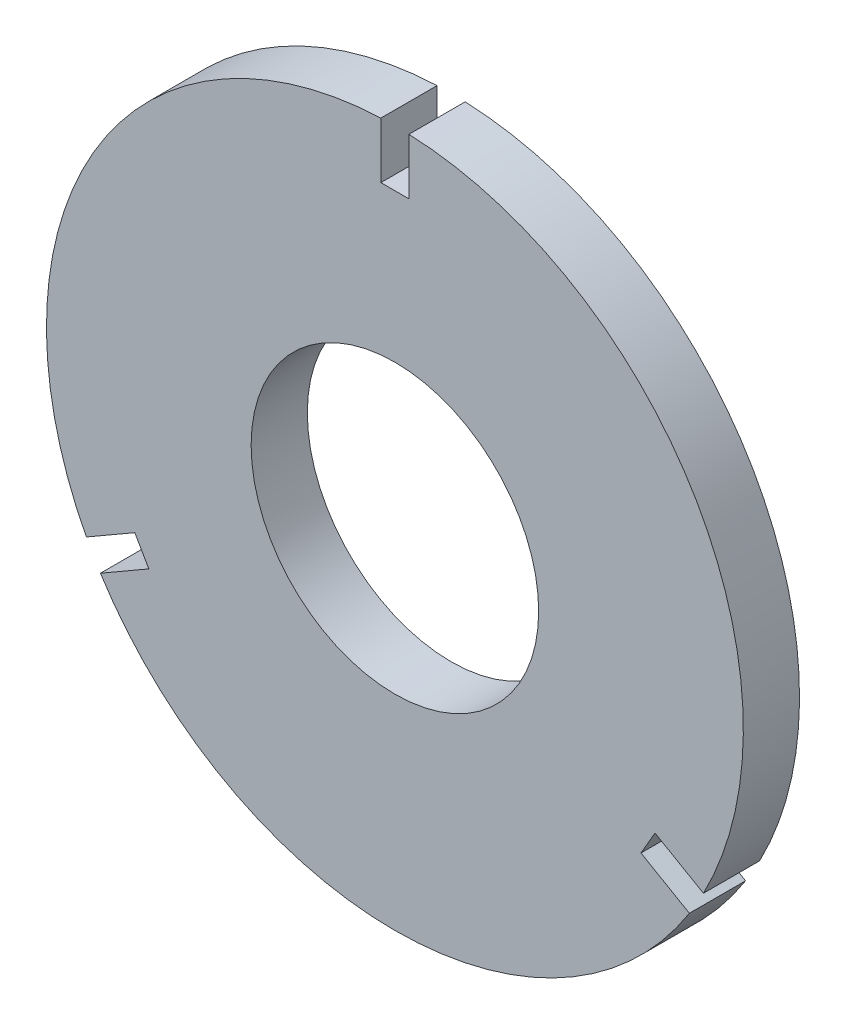
ISO-10303-21;
HEADER;
FILE_DESCRIPTION(('STEP AP214'),'2;1');
FILE_NAME('part.step','',(''),(''),'','','');
FILE_SCHEMA(('AUTOMOTIVE_DESIGN { 1 0 10303 214 1 1 1 1 }'));
ENDSEC;
DATA;
#1=APPLICATION_CONTEXT('core data for automotive mechanical design processes');
#2=APPLICATION_PROTOCOL_DEFINITION('international standard','automotive_design',2000,#1);
#3=PRODUCT_CONTEXT('',#1,'mechanical');
#4=PRODUCT('Part','Part','',(#3));
#5=PRODUCT_RELATED_PRODUCT_CATEGORY('part','',(#4));
#6=PRODUCT_DEFINITION_FORMATION('','',#4);
#7=PRODUCT_DEFINITION_CONTEXT('part definition',#1,'design');
#8=PRODUCT_DEFINITION('design','',#6,#7);
#9=PRODUCT_DEFINITION_SHAPE('','',#8);
#10=(LENGTH_UNIT() NAMED_UNIT(*) SI_UNIT(.MILLI.,.METRE.));
#11=(NAMED_UNIT(*) PLANE_ANGLE_UNIT() SI_UNIT($,.RADIAN.));
#12=(NAMED_UNIT(*) SI_UNIT($,.STERADIAN.) SOLID_ANGLE_UNIT());
#13=UNCERTAINTY_MEASURE_WITH_UNIT(LENGTH_MEASURE(1.E-05),#10,'distance_accuracy_value','');
#14=(GEOMETRIC_REPRESENTATION_CONTEXT(3) GLOBAL_UNCERTAINTY_ASSIGNED_CONTEXT((#13)) GLOBAL_UNIT_ASSIGNED_CONTEXT((#10,
#11,#12)) REPRESENTATION_CONTEXT('',''));
#15=CARTESIAN_POINT('',(0.,0.,0.));
#16=DIRECTION('',(0.,0.,1.));
#17=DIRECTION('',(1.,0.,0.));
#18=AXIS2_PLACEMENT_3D('',#15,#16,#17);
#19=CARTESIAN_POINT('',(0.,0.,6.));
#20=DIRECTION('',(0.,0.,-1.));
#21=DIRECTION('',(-1.,0.,0.));
#22=AXIS2_PLACEMENT_3D('',#19,#20,#21);
#23=CYLINDRICAL_SURFACE('',#22,37.2);
#24=CARTESIAN_POINT('',(0.,0.,6.));
#25=DIRECTION('',(0.,0.,1.));
#26=DIRECTION('',(1.,0.,0.));
#27=AXIS2_PLACEMENT_3D('',#24,#25,#26);
#28=CIRCLE('',#27,37.2);
#29=CARTESIAN_POINT('',(32.9399440819644,-17.2858347752447,6.));
#30=VERTEX_POINT('',#29);
#31=CARTESIAN_POINT('',(1.5,37.1697457618424,6.));
#32=VERTEX_POINT('',#31);
#33=EDGE_CURVE('E210',#30,#32,#28,.T.);
#34=ORIENTED_EDGE('',*,*,#33,.F.);
#35=DIRECTION('',(0.,0.,-1.));
#36=VECTOR('',#35,1.);
#37=CARTESIAN_POINT('',(32.9399440819644,-17.2858347752447,6.));
#38=LINE('',#37,#36);
#39=CARTESIAN_POINT('',(32.9399440819644,-17.2858347752447,0.));
#40=VERTEX_POINT('',#39);
#41=EDGE_CURVE('E11',#30,#40,#38,.T.);
#42=ORIENTED_EDGE('',*,*,#41,.T.);
#43=CARTESIAN_POINT('',(0.,0.,0.));
#44=DIRECTION('',(0.,0.,1.));
#45=DIRECTION('',(1.,0.,0.));
#46=AXIS2_PLACEMENT_3D('',#43,#44,#45);
#47=CIRCLE('',#46,37.2);
#48=CARTESIAN_POINT('',(1.5,37.1697457618424,0.));
#49=VERTEX_POINT('',#48);
#50=EDGE_CURVE('E155',#40,#49,#47,.T.);
#51=ORIENTED_EDGE('',*,*,#50,.T.);
#52=DIRECTION('',(0.,0.,-1.));
#53=VECTOR('',#52,1.);
#54=CARTESIAN_POINT('',(1.5,37.1697457618424,6.));
#55=LINE('',#54,#53);
#56=EDGE_CURVE('E223',#49,#32,#55,.F.);
#57=ORIENTED_EDGE('',*,*,#56,.T.);
#58=EDGE_LOOP('',(#34,#42,#51,#57));
#59=FACE_BOUND('',#58,.T.);
#60=ADVANCED_FACE('F42',(#59),#23,.T.);
#61=CARTESIAN_POINT('',(-1.5,37.1697457618424,6.));
#62=VERTEX_POINT('',#61);
#63=CARTESIAN_POINT('',(-32.9399440819646,-17.2858347752442,6.));
#64=VERTEX_POINT('',#63);
#65=EDGE_CURVE('E215',#62,#64,#28,.T.);
#66=ORIENTED_EDGE('',*,*,#65,.F.);
#67=DIRECTION('',(0.,0.,-1.));
#68=VECTOR('',#67,1.);
#69=CARTESIAN_POINT('',(-1.5,37.1697457618424,6.));
#70=LINE('',#69,#68);
#71=CARTESIAN_POINT('',(-1.5,37.1697457618424,0.));
#72=VERTEX_POINT('',#71);
#73=EDGE_CURVE('E226',#62,#72,#70,.T.);
#74=ORIENTED_EDGE('',*,*,#73,.T.);
#75=CARTESIAN_POINT('',(-32.9399440819646,-17.2858347752442,0.));
#76=VERTEX_POINT('',#75);
#77=EDGE_CURVE('E214',#72,#76,#47,.T.);
#78=ORIENTED_EDGE('',*,*,#77,.T.);
#79=DIRECTION('',(0.,0.,-1.));
#80=VECTOR('',#79,1.);
#81=CARTESIAN_POINT('',(-32.9399440819646,-17.2858347752442,6.));
#82=LINE('',#81,#80);
#83=EDGE_CURVE('E218',#76,#64,#82,.F.);
#84=ORIENTED_EDGE('',*,*,#83,.T.);
#85=EDGE_LOOP('',(#66,#74,#78,#84));
#86=FACE_BOUND('',#85,.T.);
#87=ADVANCED_FACE('F243',(#86),#23,.T.);
#88=CARTESIAN_POINT('',(0.,0.,6.));
#89=DIRECTION('',(0.,0.,1.));
#90=DIRECTION('',(1.,0.,0.));
#91=AXIS2_PLACEMENT_3D('',#88,#89,#90);
#92=PLANE('',#91);
#93=DIRECTION('',(-0.866025403784436,0.500000000000004,0.));
#94=VECTOR('',#93,1.);
#95=CARTESIAN_POINT('',(32.966145020781,-17.3009618943235,6.));
#96=LINE('',#95,#94);
#97=CARTESIAN_POINT('',(27.7699925980744,-14.3009618943235,6.));
#98=VERTEX_POINT('',#97);
#99=EDGE_CURVE('E136',#30,#98,#96,.T.);
#100=ORIENTED_EDGE('',*,*,#99,.F.);
#101=ORIENTED_EDGE('',*,*,#33,.T.);
#102=DIRECTION('',(0.,1.,0.));
#103=VECTOR('',#102,1.);
#104=CARTESIAN_POINT('',(1.5,31.2,6.));
#105=LINE('',#104,#103);
#106=CARTESIAN_POINT('',(1.5,31.2,6.));
#107=VERTEX_POINT('',#106);
#108=EDGE_CURVE('E173',#107,#32,#105,.T.);
#109=ORIENTED_EDGE('',*,*,#108,.F.);
#110=DIRECTION('',(1.,0.,0.));
#111=VECTOR('',#110,1.);
#112=CARTESIAN_POINT('',(-1.5,31.2,6.));
#113=LINE('',#112,#111);
#114=CARTESIAN_POINT('',(-1.5,31.2,6.));
#115=VERTEX_POINT('',#114);
#116=EDGE_CURVE('E175',#115,#107,#113,.T.);
#117=ORIENTED_EDGE('',*,*,#116,.F.);
#118=DIRECTION('',(0.,-1.,0.));
#119=VECTOR('',#118,1.);
#120=CARTESIAN_POINT('',(-1.5,37.2,6.));
#121=LINE('',#120,#119);
#122=EDGE_CURVE('E162',#62,#115,#121,.T.);
#123=ORIENTED_EDGE('',*,*,#122,.F.);
#124=ORIENTED_EDGE('',*,*,#65,.T.);
#125=DIRECTION('',(-0.866025403784443,-0.499999999999992,0.));
#126=VECTOR('',#125,1.);
#127=CARTESIAN_POINT('',(-27.7699925980746,-14.3009618943231,6.));
#128=LINE('',#127,#126);
#129=CARTESIAN_POINT('',(-27.7699925980746,-14.3009618943231,6.));
#130=VERTEX_POINT('',#129);
#131=EDGE_CURVE('E65',#130,#64,#128,.T.);
#132=ORIENTED_EDGE('',*,*,#131,.F.);
#133=DIRECTION('',(-0.499999999999991,0.866025403784444,0.));
#134=VECTOR('',#133,1.);
#135=CARTESIAN_POINT('',(-26.2699925980746,-16.8990381056764,6.));
#136=LINE('',#135,#134);
#137=CARTESIAN_POINT('',(-26.2699925980746,-16.8990381056764,6.));
#138=VERTEX_POINT('',#137);
#139=EDGE_CURVE('E193',#138,#130,#136,.T.);
#140=ORIENTED_EDGE('',*,*,#139,.F.);
#141=DIRECTION('',(0.866025403784444,0.499999999999991,0.));
#142=VECTOR('',#141,1.);
#143=CARTESIAN_POINT('',(-31.4661450207813,-19.8990381056764,6.));
#144=LINE('',#143,#142);
#145=CARTESIAN_POINT('',(-31.4399440819647,-19.8839109865976,6.));
#146=VERTEX_POINT('',#145);
#147=EDGE_CURVE('E172',#146,#138,#144,.T.);
#148=ORIENTED_EDGE('',*,*,#147,.F.);
#149=CARTESIAN_POINT('',(31.4399440819644,-19.883910986598,6.));
#150=VERTEX_POINT('',#149);
#151=EDGE_CURVE('E213',#146,#150,#28,.T.);
#152=ORIENTED_EDGE('',*,*,#151,.T.);
#153=DIRECTION('',(0.866025403784436,-0.500000000000004,0.));
#154=VECTOR('',#153,1.);
#155=CARTESIAN_POINT('',(26.2699925980744,-16.8990381056768,6.));
#156=LINE('',#155,#154);
#157=CARTESIAN_POINT('',(26.2699925980744,-16.8990381056768,6.));
#158=VERTEX_POINT('',#157);
#159=EDGE_CURVE('E57',#158,#150,#156,.T.);
#160=ORIENTED_EDGE('',*,*,#159,.F.);
#161=DIRECTION('',(-0.500000000000005,-0.866025403784436,0.));
#162=VECTOR('',#161,1.);
#163=CARTESIAN_POINT('',(27.7699925980744,-14.3009618943235,6.));
#164=LINE('',#163,#162);
#165=EDGE_CURVE('E157',#98,#158,#164,.T.);
#166=ORIENTED_EDGE('',*,*,#165,.F.);
#167=EDGE_LOOP('',(#100,#101,#109,#117,#123,#124,#132,#140,#148,#152,#160,#166));
#168=FACE_BOUND('',#167,.T.);
#169=CARTESIAN_POINT('',(0.,0.,6.));
#170=DIRECTION('',(0.,0.,1.));
#171=DIRECTION('',(1.,0.,0.));
#172=AXIS2_PLACEMENT_3D('',#169,#170,#171);
#173=CIRCLE('',#172,15.35);
#174=CARTESIAN_POINT('',(15.35,0.,6.));
#175=VERTEX_POINT('',#174);
#176=EDGE_CURVE('E205',#175,#175,#173,.T.);
#177=ORIENTED_EDGE('',*,*,#176,.F.);
#178=EDGE_LOOP('',(#177));
#179=FACE_BOUND('',#178,.T.);
#180=ADVANCED_FACE('F235',(#168,#179),#92,.T.);
#181=CARTESIAN_POINT('',(0.,0.,0.));
#182=DIRECTION('',(0.,0.,1.));
#183=DIRECTION('',(1.,0.,0.));
#184=AXIS2_PLACEMENT_3D('',#181,#182,#183);
#185=PLANE('',#184);
#186=ORIENTED_EDGE('',*,*,#50,.F.);
#187=DIRECTION('',(-0.866025403784436,0.500000000000004,0.));
#188=VECTOR('',#187,1.);
#189=CARTESIAN_POINT('',(32.966145020781,-17.3009618943235,0.));
#190=LINE('',#189,#188);
#191=CARTESIAN_POINT('',(27.7699925980744,-14.3009618943235,0.));
#192=VERTEX_POINT('',#191);
#193=EDGE_CURVE('E134',#40,#192,#190,.T.);
#194=ORIENTED_EDGE('',*,*,#193,.T.);
#195=DIRECTION('',(-0.500000000000005,-0.866025403784436,0.));
#196=VECTOR('',#195,1.);
#197=CARTESIAN_POINT('',(27.7699925980744,-14.3009618943235,0.));
#198=LINE('',#197,#196);
#199=CARTESIAN_POINT('',(26.2699925980744,-16.8990381056768,0.));
#200=VERTEX_POINT('',#199);
#201=EDGE_CURVE('E144',#192,#200,#198,.T.);
#202=ORIENTED_EDGE('',*,*,#201,.T.);
#203=DIRECTION('',(0.866025403784436,-0.500000000000004,0.));
#204=VECTOR('',#203,1.);
#205=CARTESIAN_POINT('',(26.2699925980744,-16.8990381056768,0.));
#206=LINE('',#205,#204);
#207=CARTESIAN_POINT('',(31.4399440819644,-19.883910986598,0.));
#208=VERTEX_POINT('',#207);
#209=EDGE_CURVE('E141',#200,#208,#206,.T.);
#210=ORIENTED_EDGE('',*,*,#209,.T.);
#211=CARTESIAN_POINT('',(-31.4399440819647,-19.8839109865976,0.));
#212=VERTEX_POINT('',#211);
#213=EDGE_CURVE('E217',#212,#208,#47,.T.);
#214=ORIENTED_EDGE('',*,*,#213,.F.);
#215=DIRECTION('',(0.866025403784444,0.499999999999991,0.));
#216=VECTOR('',#215,1.);
#217=CARTESIAN_POINT('',(-31.4661450207813,-19.8990381056764,0.));
#218=LINE('',#217,#216);
#219=CARTESIAN_POINT('',(-26.2699925980746,-16.8990381056764,0.));
#220=VERTEX_POINT('',#219);
#221=EDGE_CURVE('E194',#212,#220,#218,.T.);
#222=ORIENTED_EDGE('',*,*,#221,.T.);
#223=DIRECTION('',(-0.499999999999991,0.866025403784444,0.));
#224=VECTOR('',#223,1.);
#225=CARTESIAN_POINT('',(-26.2699925980746,-16.8990381056764,0.));
#226=LINE('',#225,#224);
#227=CARTESIAN_POINT('',(-27.7699925980746,-14.3009618943231,0.));
#228=VERTEX_POINT('',#227);
#229=EDGE_CURVE('E200',#220,#228,#226,.T.);
#230=ORIENTED_EDGE('',*,*,#229,.T.);
#231=DIRECTION('',(-0.866025403784443,-0.499999999999992,0.));
#232=VECTOR('',#231,1.);
#233=CARTESIAN_POINT('',(-27.7699925980746,-14.3009618943231,0.));
#234=LINE('',#233,#232);
#235=EDGE_CURVE('E189',#228,#76,#234,.T.);
#236=ORIENTED_EDGE('',*,*,#235,.T.);
#237=ORIENTED_EDGE('',*,*,#77,.F.);
#238=DIRECTION('',(0.,-1.,0.));
#239=VECTOR('',#238,1.);
#240=CARTESIAN_POINT('',(-1.5,37.2,0.));
#241=LINE('',#240,#239);
#242=CARTESIAN_POINT('',(-1.5,31.2,0.));
#243=VERTEX_POINT('',#242);
#244=EDGE_CURVE('E176',#72,#243,#241,.T.);
#245=ORIENTED_EDGE('',*,*,#244,.T.);
#246=DIRECTION('',(1.,0.,0.));
#247=VECTOR('',#246,1.);
#248=CARTESIAN_POINT('',(-1.5,31.2,0.));
#249=LINE('',#248,#247);
#250=CARTESIAN_POINT('',(1.5,31.2,0.));
#251=VERTEX_POINT('',#250);
#252=EDGE_CURVE('E181',#243,#251,#249,.T.);
#253=ORIENTED_EDGE('',*,*,#252,.T.);
#254=DIRECTION('',(0.,1.,0.));
#255=VECTOR('',#254,1.);
#256=CARTESIAN_POINT('',(1.5,31.2,0.));
#257=LINE('',#256,#255);
#258=EDGE_CURVE('E169',#251,#49,#257,.T.);
#259=ORIENTED_EDGE('',*,*,#258,.T.);
#260=EDGE_LOOP('',(#186,#194,#202,#210,#214,#222,#230,#236,#237,#245,#253,#259));
#261=FACE_BOUND('',#260,.T.);
#262=CARTESIAN_POINT('',(0.,0.,0.));
#263=DIRECTION('',(0.,0.,1.));
#264=DIRECTION('',(1.,0.,0.));
#265=AXIS2_PLACEMENT_3D('',#262,#263,#264);
#266=CIRCLE('',#265,15.35);
#267=CARTESIAN_POINT('',(15.35,0.,0.));
#268=VERTEX_POINT('',#267);
#269=EDGE_CURVE('E164',#268,#268,#266,.T.);
#270=ORIENTED_EDGE('',*,*,#269,.T.);
#271=EDGE_LOOP('',(#270));
#272=FACE_BOUND('',#271,.T.);
#273=ADVANCED_FACE('F151',(#261,#272),#185,.F.);
#274=ORIENTED_EDGE('',*,*,#213,.T.);
#275=DIRECTION('',(0.,0.,-1.));
#276=VECTOR('',#275,1.);
#277=CARTESIAN_POINT('',(31.4399440819644,-19.883910986598,6.));
#278=LINE('',#277,#276);
#279=EDGE_CURVE('E50',#208,#150,#278,.F.);
#280=ORIENTED_EDGE('',*,*,#279,.T.);
#281=ORIENTED_EDGE('',*,*,#151,.F.);
#282=DIRECTION('',(0.,0.,-1.));
#283=VECTOR('',#282,1.);
#284=CARTESIAN_POINT('',(-31.4399440819647,-19.8839109865976,6.));
#285=LINE('',#284,#283);
#286=EDGE_CURVE('E220',#146,#212,#285,.T.);
#287=ORIENTED_EDGE('',*,*,#286,.T.);
#288=EDGE_LOOP('',(#274,#280,#281,#287));
#289=FACE_BOUND('',#288,.T.);
#290=ADVANCED_FACE('F44',(#289),#23,.T.);
#291=CARTESIAN_POINT('',(0.,0.,6.));
#292=DIRECTION('',(0.,0.,-1.));
#293=DIRECTION('',(-1.,0.,0.));
#294=AXIS2_PLACEMENT_3D('',#291,#292,#293);
#295=CYLINDRICAL_SURFACE('',#294,15.35);
#296=ORIENTED_EDGE('',*,*,#176,.T.);
#297=EDGE_LOOP('',(#296));
#298=FACE_BOUND('',#297,.T.);
#299=ORIENTED_EDGE('',*,*,#269,.F.);
#300=EDGE_LOOP('',(#299));
#301=FACE_BOUND('',#300,.T.);
#302=ADVANCED_FACE('F281',(#298,#301),#295,.F.);
#303=CARTESIAN_POINT('',(-31.4661450207813,-19.8990381056764,0.));
#304=DIRECTION('',(0.499999999999991,-0.866025403784444,0.));
#305=DIRECTION('',(0.866025403784444,0.499999999999991,0.));
#306=AXIS2_PLACEMENT_3D('',#303,#304,#305);
#307=PLANE('',#306);
#308=ORIENTED_EDGE('',*,*,#147,.T.);
#309=DIRECTION('',(0.,0.,1.));
#310=VECTOR('',#309,1.);
#311=CARTESIAN_POINT('',(-26.2699925980746,-16.8990381056764,0.));
#312=LINE('',#311,#310);
#313=EDGE_CURVE('E186',#220,#138,#312,.T.);
#314=ORIENTED_EDGE('',*,*,#313,.F.);
#315=ORIENTED_EDGE('',*,*,#221,.F.);
#316=ORIENTED_EDGE('',*,*,#286,.F.);
#317=EDGE_LOOP('',(#308,#314,#315,#316));
#318=FACE_BOUND('',#317,.T.);
#319=ADVANCED_FACE('F252',(#318),#307,.F.);
#320=CARTESIAN_POINT('',(-27.7699925980746,-14.3009618943231,0.));
#321=DIRECTION('',(-0.499999999999992,0.866025403784443,0.));
#322=DIRECTION('',(-0.866025403784443,-0.499999999999992,0.));
#323=AXIS2_PLACEMENT_3D('',#320,#321,#322);
#324=PLANE('',#323);
#325=ORIENTED_EDGE('',*,*,#235,.F.);
#326=DIRECTION('',(0.,0.,1.));
#327=VECTOR('',#326,1.);
#328=CARTESIAN_POINT('',(-27.7699925980746,-14.3009618943231,0.));
#329=LINE('',#328,#327);
#330=EDGE_CURVE('E190',#228,#130,#329,.T.);
#331=ORIENTED_EDGE('',*,*,#330,.T.);
#332=ORIENTED_EDGE('',*,*,#131,.T.);
#333=ORIENTED_EDGE('',*,*,#83,.F.);
#334=EDGE_LOOP('',(#325,#331,#332,#333));
#335=FACE_BOUND('',#334,.T.);
#336=ADVANCED_FACE('F247',(#335),#324,.F.);
#337=CARTESIAN_POINT('',(-26.2699925980746,-16.8990381056764,0.));
#338=DIRECTION('',(0.866025403784444,0.499999999999991,0.));
#339=DIRECTION('',(-0.499999999999991,0.866025403784444,0.));
#340=AXIS2_PLACEMENT_3D('',#337,#338,#339);
#341=PLANE('',#340);
#342=ORIENTED_EDGE('',*,*,#139,.T.);
#343=ORIENTED_EDGE('',*,*,#330,.F.);
#344=ORIENTED_EDGE('',*,*,#229,.F.);
#345=ORIENTED_EDGE('',*,*,#313,.T.);
#346=EDGE_LOOP('',(#342,#343,#344,#345));
#347=FACE_BOUND('',#346,.T.);
#348=ADVANCED_FACE('F250',(#347),#341,.F.);
#349=CARTESIAN_POINT('',(-1.5,37.2,0.));
#350=DIRECTION('',(-1.,0.,0.));
#351=DIRECTION('',(0.,-1.,0.));
#352=AXIS2_PLACEMENT_3D('',#349,#350,#351);
#353=PLANE('',#352);
#354=ORIENTED_EDGE('',*,*,#122,.T.);
#355=DIRECTION('',(0.,0.,1.));
#356=VECTOR('',#355,1.);
#357=CARTESIAN_POINT('',(-1.5,31.2,0.));
#358=LINE('',#357,#356);
#359=EDGE_CURVE('E166',#243,#115,#358,.T.);
#360=ORIENTED_EDGE('',*,*,#359,.F.);
#361=ORIENTED_EDGE('',*,*,#244,.F.);
#362=ORIENTED_EDGE('',*,*,#73,.F.);
#363=EDGE_LOOP('',(#354,#360,#361,#362));
#364=FACE_BOUND('',#363,.T.);
#365=ADVANCED_FACE('F264',(#364),#353,.F.);
#366=CARTESIAN_POINT('',(1.5,31.2,0.));
#367=DIRECTION('',(1.,0.,0.));
#368=DIRECTION('',(0.,1.,0.));
#369=AXIS2_PLACEMENT_3D('',#366,#367,#368);
#370=PLANE('',#369);
#371=ORIENTED_EDGE('',*,*,#258,.F.);
#372=DIRECTION('',(0.,0.,1.));
#373=VECTOR('',#372,1.);
#374=CARTESIAN_POINT('',(1.5,31.2,0.));
#375=LINE('',#374,#373);
#376=EDGE_CURVE('E170',#251,#107,#375,.T.);
#377=ORIENTED_EDGE('',*,*,#376,.T.);
#378=ORIENTED_EDGE('',*,*,#108,.T.);
#379=ORIENTED_EDGE('',*,*,#56,.F.);
#380=EDGE_LOOP('',(#371,#377,#378,#379));
#381=FACE_BOUND('',#380,.T.);
#382=ADVANCED_FACE('F259',(#381),#370,.F.);
#383=CARTESIAN_POINT('',(-1.5,31.2,0.));
#384=DIRECTION('',(0.,-1.,0.));
#385=DIRECTION('',(0.,0.,-1.));
#386=AXIS2_PLACEMENT_3D('',#383,#384,#385);
#387=PLANE('',#386);
#388=ORIENTED_EDGE('',*,*,#116,.T.);
#389=ORIENTED_EDGE('',*,*,#376,.F.);
#390=ORIENTED_EDGE('',*,*,#252,.F.);
#391=ORIENTED_EDGE('',*,*,#359,.T.);
#392=EDGE_LOOP('',(#388,#389,#390,#391));
#393=FACE_BOUND('',#392,.T.);
#394=ADVANCED_FACE('F262',(#393),#387,.F.);
#395=CARTESIAN_POINT('',(32.966145020781,-17.3009618943235,0.));
#396=DIRECTION('',(0.500000000000004,0.866025403784436,0.));
#397=DIRECTION('',(-0.866025403784436,0.500000000000004,0.));
#398=AXIS2_PLACEMENT_3D('',#395,#396,#397);
#399=PLANE('',#398);
#400=ORIENTED_EDGE('',*,*,#99,.T.);
#401=DIRECTION('',(0.,0.,1.));
#402=VECTOR('',#401,1.);
#403=CARTESIAN_POINT('',(27.7699925980744,-14.3009618943235,0.));
#404=LINE('',#403,#402);
#405=EDGE_CURVE('E130',#192,#98,#404,.T.);
#406=ORIENTED_EDGE('',*,*,#405,.F.);
#407=ORIENTED_EDGE('',*,*,#193,.F.);
#408=ORIENTED_EDGE('',*,*,#41,.F.);
#409=EDGE_LOOP('',(#400,#406,#407,#408));
#410=FACE_BOUND('',#409,.T.);
#411=ADVANCED_FACE('F132',(#410),#399,.F.);
#412=CARTESIAN_POINT('',(26.2699925980744,-16.8990381056768,0.));
#413=DIRECTION('',(-0.500000000000004,-0.866025403784436,0.));
#414=DIRECTION('',(0.866025403784436,-0.500000000000004,0.));
#415=AXIS2_PLACEMENT_3D('',#412,#413,#414);
#416=PLANE('',#415);
#417=ORIENTED_EDGE('',*,*,#209,.F.);
#418=DIRECTION('',(0.,0.,1.));
#419=VECTOR('',#418,1.);
#420=CARTESIAN_POINT('',(26.2699925980744,-16.8990381056768,0.));
#421=LINE('',#420,#419);
#422=EDGE_CURVE('E140',#200,#158,#421,.T.);
#423=ORIENTED_EDGE('',*,*,#422,.T.);
#424=ORIENTED_EDGE('',*,*,#159,.T.);
#425=ORIENTED_EDGE('',*,*,#279,.F.);
#426=EDGE_LOOP('',(#417,#423,#424,#425));
#427=FACE_BOUND('',#426,.T.);
#428=ADVANCED_FACE('F253',(#427),#416,.F.);
#429=CARTESIAN_POINT('',(27.7699925980744,-14.3009618943235,0.));
#430=DIRECTION('',(-0.866025403784436,0.500000000000005,0.));
#431=DIRECTION('',(-0.500000000000005,-0.866025403784436,0.));
#432=AXIS2_PLACEMENT_3D('',#429,#430,#431);
#433=PLANE('',#432);
#434=ORIENTED_EDGE('',*,*,#165,.T.);
#435=ORIENTED_EDGE('',*,*,#422,.F.);
#436=ORIENTED_EDGE('',*,*,#201,.F.);
#437=ORIENTED_EDGE('',*,*,#405,.T.);
#438=EDGE_LOOP('',(#434,#435,#436,#437));
#439=FACE_BOUND('',#438,.T.);
#440=ADVANCED_FACE('F145',(#439),#433,.F.);
#441=CLOSED_SHELL('',(#60,#87,#180,#273,#290,#302,#319,#336,#348,#365,#382,#394,#411,#428,#440));
#442=MANIFOLD_SOLID_BREP('B2',#441);
#443=ADVANCED_BREP_SHAPE_REPRESENTATION('',(#18,#442),#14);
#444=SHAPE_DEFINITION_REPRESENTATION(#9,#443);
ENDSEC;
END-ISO-10303-21;
